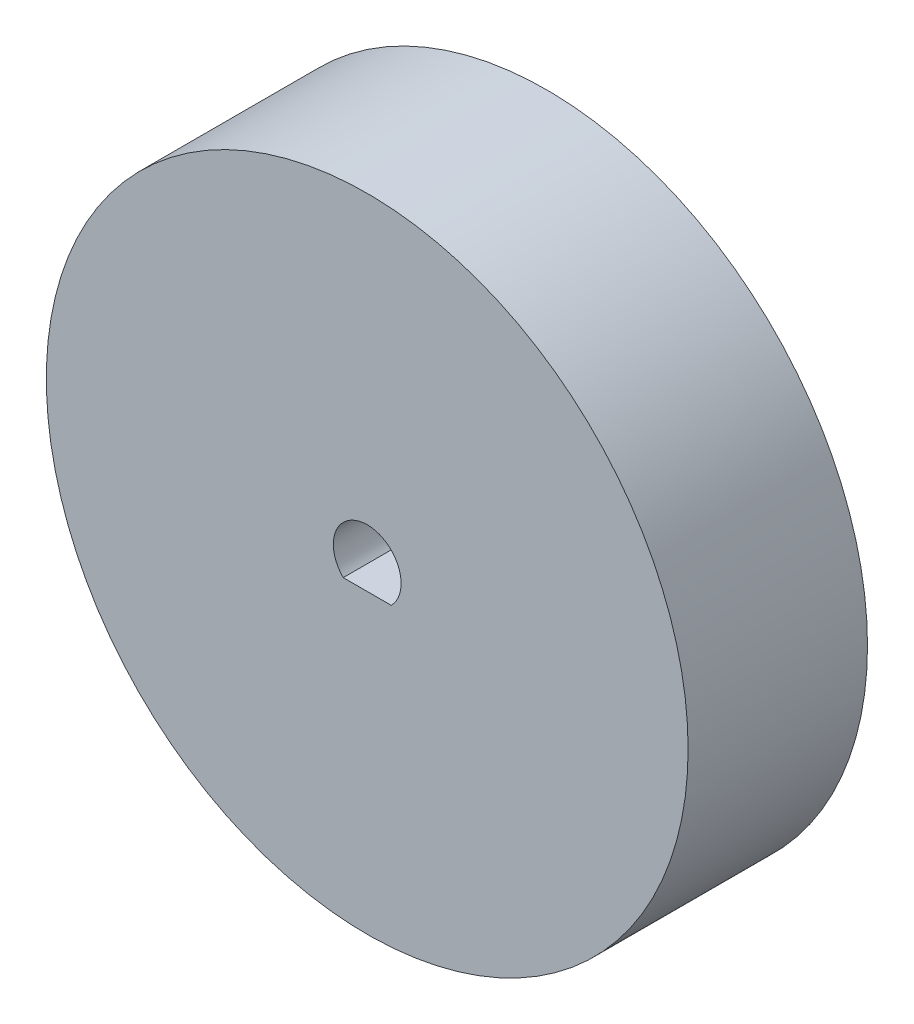
ISO-10303-21;
HEADER;
FILE_DESCRIPTION(('STEP AP214'),'2;1');
FILE_NAME('part.step','',(''),(''),'','','');
FILE_SCHEMA(('AUTOMOTIVE_DESIGN { 1 0 10303 214 1 1 1 1 }'));
ENDSEC;
DATA;
#1=APPLICATION_CONTEXT('core data for automotive mechanical design processes');
#2=APPLICATION_PROTOCOL_DEFINITION('international standard','automotive_design',2000,#1);
#3=PRODUCT_CONTEXT('',#1,'mechanical');
#4=PRODUCT('Part','Part','',(#3));
#5=PRODUCT_RELATED_PRODUCT_CATEGORY('part','',(#4));
#6=PRODUCT_DEFINITION_FORMATION('','',#4);
#7=PRODUCT_DEFINITION_CONTEXT('part definition',#1,'design');
#8=PRODUCT_DEFINITION('design','',#6,#7);
#9=PRODUCT_DEFINITION_SHAPE('','',#8);
#10=(LENGTH_UNIT() NAMED_UNIT(*) SI_UNIT(.MILLI.,.METRE.));
#11=(NAMED_UNIT(*) PLANE_ANGLE_UNIT() SI_UNIT($,.RADIAN.));
#12=(NAMED_UNIT(*) SI_UNIT($,.STERADIAN.) SOLID_ANGLE_UNIT());
#13=UNCERTAINTY_MEASURE_WITH_UNIT(LENGTH_MEASURE(1.E-05),#10,'distance_accuracy_value','');
#14=(GEOMETRIC_REPRESENTATION_CONTEXT(3) GLOBAL_UNCERTAINTY_ASSIGNED_CONTEXT((#13)) GLOBAL_UNIT_ASSIGNED_CONTEXT((#10,
#11,#12)) REPRESENTATION_CONTEXT('',''));
#15=CARTESIAN_POINT('',(0.,0.,0.));
#16=DIRECTION('',(0.,0.,1.));
#17=DIRECTION('',(1.,0.,0.));
#18=AXIS2_PLACEMENT_3D('',#15,#16,#17);
#19=CARTESIAN_POINT('',(0.,0.,9.));
#20=DIRECTION('',(0.,0.,1.));
#21=DIRECTION('',(1.,0.,0.));
#22=AXIS2_PLACEMENT_3D('',#19,#20,#21);
#23=PLANE('',#22);
#24=CARTESIAN_POINT('',(0.,0.,9.));
#25=DIRECTION('',(0.,0.,1.));
#26=DIRECTION('',(1.,0.,0.));
#27=AXIS2_PLACEMENT_3D('',#24,#25,#26);
#28=CIRCLE('',#27,16.1);
#29=CARTESIAN_POINT('',(16.1,0.,9.));
#30=VERTEX_POINT('',#29);
#31=EDGE_CURVE('E11',#30,#30,#28,.T.);
#32=ORIENTED_EDGE('',*,*,#31,.T.);
#33=EDGE_LOOP('',(#32));
#34=FACE_BOUND('',#33,.T.);
#35=DIRECTION('',(1.,0.,0.));
#36=VECTOR('',#35,1.);
#37=CARTESIAN_POINT('',(-1.20415945787923,-1.2,9.));
#38=LINE('',#37,#36);
#39=CARTESIAN_POINT('',(-1.20415945787923,-1.2,9.));
#40=VERTEX_POINT('',#39);
#41=CARTESIAN_POINT('',(1.20415945787923,-1.2,9.));
#42=VERTEX_POINT('',#41);
#43=EDGE_CURVE('E86',#40,#42,#38,.T.);
#44=ORIENTED_EDGE('',*,*,#43,.F.);
#45=CARTESIAN_POINT('',(0.,0.,9.));
#46=DIRECTION('',(0.,0.,1.));
#47=DIRECTION('',(1.,0.,0.));
#48=AXIS2_PLACEMENT_3D('',#45,#46,#47);
#49=CIRCLE('',#48,1.7);
#50=EDGE_CURVE('E75',#42,#40,#49,.T.);
#51=ORIENTED_EDGE('',*,*,#50,.F.);
#52=EDGE_LOOP('',(#44,#51));
#53=FACE_BOUND('',#52,.T.);
#54=ADVANCED_FACE('F41',(#34,#53),#23,.T.);
#55=CARTESIAN_POINT('',(0.,0.,0.));
#56=DIRECTION('',(0.,0.,1.));
#57=DIRECTION('',(1.,0.,0.));
#58=AXIS2_PLACEMENT_3D('',#55,#56,#57);
#59=PLANE('',#58);
#60=CARTESIAN_POINT('',(0.,0.,0.));
#61=DIRECTION('',(0.,0.,1.));
#62=DIRECTION('',(1.,0.,0.));
#63=AXIS2_PLACEMENT_3D('',#60,#61,#62);
#64=CIRCLE('',#63,16.1);
#65=CARTESIAN_POINT('',(16.1,0.,0.));
#66=VERTEX_POINT('',#65);
#67=EDGE_CURVE('E45',#66,#66,#64,.T.);
#68=ORIENTED_EDGE('',*,*,#67,.F.);
#69=EDGE_LOOP('',(#68));
#70=FACE_BOUND('',#69,.T.);
#71=CARTESIAN_POINT('',(0.,0.,0.));
#72=DIRECTION('',(0.,0.,1.));
#73=DIRECTION('',(1.,0.,0.));
#74=AXIS2_PLACEMENT_3D('',#71,#72,#73);
#75=CIRCLE('',#74,1.7);
#76=CARTESIAN_POINT('',(1.20415945787923,-1.2,0.));
#77=VERTEX_POINT('',#76);
#78=CARTESIAN_POINT('',(-1.20415945787923,-1.2,0.));
#79=VERTEX_POINT('',#78);
#80=EDGE_CURVE('E64',#77,#79,#75,.T.);
#81=ORIENTED_EDGE('',*,*,#80,.T.);
#82=DIRECTION('',(1.,0.,0.));
#83=VECTOR('',#82,1.);
#84=CARTESIAN_POINT('',(-1.20415945787923,-1.2,0.));
#85=LINE('',#84,#83);
#86=EDGE_CURVE('E70',#79,#77,#85,.T.);
#87=ORIENTED_EDGE('',*,*,#86,.T.);
#88=EDGE_LOOP('',(#81,#87));
#89=FACE_BOUND('',#88,.T.);
#90=ADVANCED_FACE('F82',(#70,#89),#59,.F.);
#91=CARTESIAN_POINT('',(0.,0.,9.));
#92=DIRECTION('',(0.,0.,-1.));
#93=DIRECTION('',(-1.,0.,0.));
#94=AXIS2_PLACEMENT_3D('',#91,#92,#93);
#95=CYLINDRICAL_SURFACE('',#94,16.1);
#96=ORIENTED_EDGE('',*,*,#31,.F.);
#97=EDGE_LOOP('',(#96));
#98=FACE_BOUND('',#97,.T.);
#99=ORIENTED_EDGE('',*,*,#67,.T.);
#100=EDGE_LOOP('',(#99));
#101=FACE_BOUND('',#100,.T.);
#102=ADVANCED_FACE('F43',(#98,#101),#95,.T.);
#103=CARTESIAN_POINT('',(0.,0.,9.));
#104=DIRECTION('',(0.,0.,-1.));
#105=DIRECTION('',(-1.,0.,0.));
#106=AXIS2_PLACEMENT_3D('',#103,#104,#105);
#107=CYLINDRICAL_SURFACE('',#106,1.7);
#108=ORIENTED_EDGE('',*,*,#80,.F.);
#109=DIRECTION('',(0.,0.,-1.));
#110=VECTOR('',#109,1.);
#111=CARTESIAN_POINT('',(1.20415945787923,-1.2,9.));
#112=LINE('',#111,#110);
#113=EDGE_CURVE('E72',#42,#77,#112,.T.);
#114=ORIENTED_EDGE('',*,*,#113,.F.);
#115=ORIENTED_EDGE('',*,*,#50,.T.);
#116=DIRECTION('',(0.,0.,-1.));
#117=VECTOR('',#116,1.);
#118=CARTESIAN_POINT('',(-1.20415945787923,-1.2,9.));
#119=LINE('',#118,#117);
#120=EDGE_CURVE('E57',#40,#79,#119,.T.);
#121=ORIENTED_EDGE('',*,*,#120,.T.);
#122=EDGE_LOOP('',(#108,#114,#115,#121));
#123=FACE_BOUND('',#122,.T.);
#124=ADVANCED_FACE('F77',(#123),#107,.F.);
#125=CARTESIAN_POINT('',(-1.20415945787923,-1.2,9.));
#126=DIRECTION('',(0.,1.,0.));
#127=DIRECTION('',(0.,0.,1.));
#128=AXIS2_PLACEMENT_3D('',#125,#126,#127);
#129=PLANE('',#128);
#130=ORIENTED_EDGE('',*,*,#86,.F.);
#131=ORIENTED_EDGE('',*,*,#120,.F.);
#132=ORIENTED_EDGE('',*,*,#43,.T.);
#133=ORIENTED_EDGE('',*,*,#113,.T.);
#134=EDGE_LOOP('',(#130,#131,#132,#133));
#135=FACE_BOUND('',#134,.T.);
#136=ADVANCED_FACE('F71',(#135),#129,.T.);
#137=CLOSED_SHELL('',(#54,#90,#102,#124,#136));
#138=MANIFOLD_SOLID_BREP('B2',#137);
#139=ADVANCED_BREP_SHAPE_REPRESENTATION('',(#18,#138),#14);
#140=SHAPE_DEFINITION_REPRESENTATION(#9,#139);
ENDSEC;
END-ISO-10303-21;
